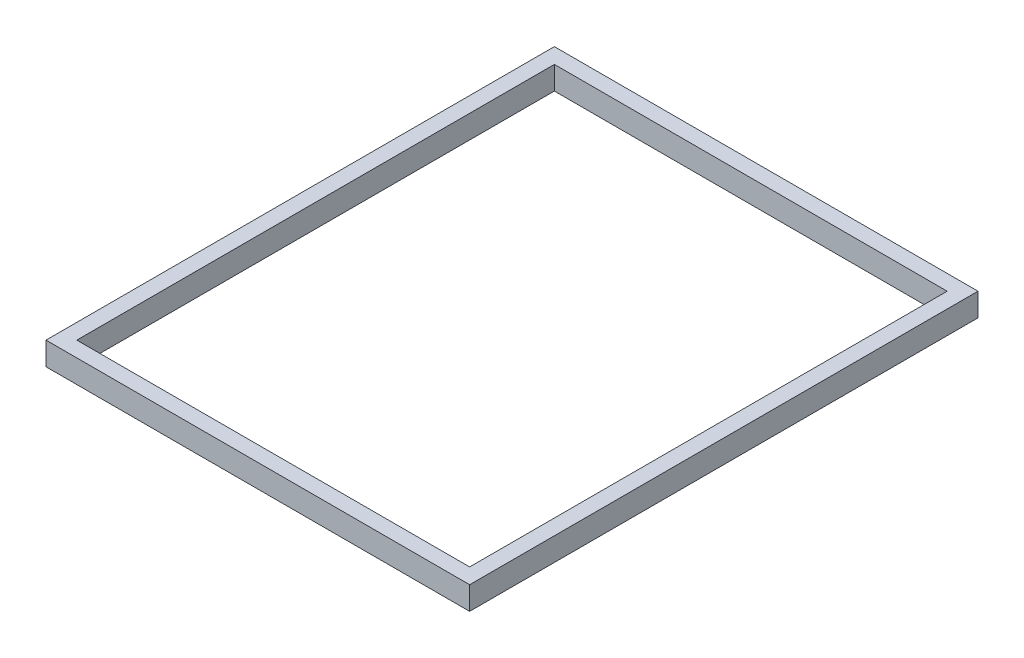
ISO-10303-21;
HEADER;
FILE_DESCRIPTION(('STEP AP214'),'2;1');
FILE_NAME('part.step','',(''),(''),'','','');
FILE_SCHEMA(('AUTOMOTIVE_DESIGN { 1 0 10303 214 1 1 1 1 }'));
ENDSEC;
DATA;
#1=APPLICATION_CONTEXT('core data for automotive mechanical design processes');
#2=APPLICATION_PROTOCOL_DEFINITION('international standard','automotive_design',2000,#1);
#3=PRODUCT_CONTEXT('',#1,'mechanical');
#4=PRODUCT('Part','Part','',(#3));
#5=PRODUCT_RELATED_PRODUCT_CATEGORY('part','',(#4));
#6=PRODUCT_DEFINITION_FORMATION('','',#4);
#7=PRODUCT_DEFINITION_CONTEXT('part definition',#1,'design');
#8=PRODUCT_DEFINITION('design','',#6,#7);
#9=PRODUCT_DEFINITION_SHAPE('','',#8);
#10=(LENGTH_UNIT() NAMED_UNIT(*) SI_UNIT(.MILLI.,.METRE.));
#11=(NAMED_UNIT(*) PLANE_ANGLE_UNIT() SI_UNIT($,.RADIAN.));
#12=(NAMED_UNIT(*) SI_UNIT($,.STERADIAN.) SOLID_ANGLE_UNIT());
#13=UNCERTAINTY_MEASURE_WITH_UNIT(LENGTH_MEASURE(1.E-05),#10,'distance_accuracy_value','');
#14=(GEOMETRIC_REPRESENTATION_CONTEXT(3) GLOBAL_UNCERTAINTY_ASSIGNED_CONTEXT((#13)) GLOBAL_UNIT_ASSIGNED_CONTEXT((#10,
#11,#12)) REPRESENTATION_CONTEXT('',''));
#15=CARTESIAN_POINT('',(0.,0.,0.));
#16=DIRECTION('',(0.,0.,1.));
#17=DIRECTION('',(1.,0.,0.));
#18=AXIS2_PLACEMENT_3D('',#15,#16,#17);
#19=CARTESIAN_POINT('',(0.,3.81,0.));
#20=DIRECTION('',(0.,-1.,0.));
#21=DIRECTION('',(0.,0.,-1.));
#22=AXIS2_PLACEMENT_3D('',#19,#20,#21);
#23=PLANE('',#22);
#24=DIRECTION('',(0.,0.,1.));
#25=VECTOR('',#24,1.);
#26=CARTESIAN_POINT('',(-34.925,3.81,41.91));
#27=LINE('',#26,#25);
#28=CARTESIAN_POINT('',(-34.925,3.81,-41.91));
#29=VERTEX_POINT('',#28);
#30=CARTESIAN_POINT('',(-34.925,3.81,41.91));
#31=VERTEX_POINT('',#30);
#32=EDGE_CURVE('E153',#29,#31,#27,.T.);
#33=ORIENTED_EDGE('',*,*,#32,.T.);
#34=DIRECTION('',(1.,0.,0.));
#35=VECTOR('',#34,1.);
#36=CARTESIAN_POINT('',(-34.925,3.81,41.91));
#37=LINE('',#36,#35);
#38=CARTESIAN_POINT('',(34.925,3.81,41.91));
#39=VERTEX_POINT('',#38);
#40=EDGE_CURVE('E157',#31,#39,#37,.T.);
#41=ORIENTED_EDGE('',*,*,#40,.T.);
#42=DIRECTION('',(0.,0.,-1.));
#43=VECTOR('',#42,1.);
#44=CARTESIAN_POINT('',(34.925,3.81,41.91));
#45=LINE('',#44,#43);
#46=CARTESIAN_POINT('',(34.925,3.81,-41.91));
#47=VERTEX_POINT('',#46);
#48=EDGE_CURVE('E161',#39,#47,#45,.T.);
#49=ORIENTED_EDGE('',*,*,#48,.T.);
#50=DIRECTION('',(-1.,0.,0.));
#51=VECTOR('',#50,1.);
#52=CARTESIAN_POINT('',(-34.925,3.81,-41.91));
#53=LINE('',#52,#51);
#54=EDGE_CURVE('E164',#47,#29,#53,.T.);
#55=ORIENTED_EDGE('',*,*,#54,.T.);
#56=EDGE_LOOP('',(#33,#41,#49,#55));
#57=FACE_BOUND('',#56,.T.);
#58=DIRECTION('',(0.,0.,1.));
#59=VECTOR('',#58,1.);
#60=CARTESIAN_POINT('',(-32.385,3.81,39.37));
#61=LINE('',#60,#59);
#62=CARTESIAN_POINT('',(-32.385,3.81,-39.37));
#63=VERTEX_POINT('',#62);
#64=CARTESIAN_POINT('',(-32.385,3.81,39.37));
#65=VERTEX_POINT('',#64);
#66=EDGE_CURVE('E105',#63,#65,#61,.T.);
#67=ORIENTED_EDGE('',*,*,#66,.F.);
#68=DIRECTION('',(-1.,0.,0.));
#69=VECTOR('',#68,1.);
#70=CARTESIAN_POINT('',(-32.385,3.81,-39.37));
#71=LINE('',#70,#69);
#72=CARTESIAN_POINT('',(32.385,3.81,-39.37));
#73=VERTEX_POINT('',#72);
#74=EDGE_CURVE('E131',#73,#63,#71,.T.);
#75=ORIENTED_EDGE('',*,*,#74,.F.);
#76=DIRECTION('',(0.,0.,-1.));
#77=VECTOR('',#76,1.);
#78=CARTESIAN_POINT('',(32.385,3.81,39.37));
#79=LINE('',#78,#77);
#80=CARTESIAN_POINT('',(32.385,3.81,39.37));
#81=VERTEX_POINT('',#80);
#82=EDGE_CURVE('E127',#81,#73,#79,.T.);
#83=ORIENTED_EDGE('',*,*,#82,.F.);
#84=DIRECTION('',(1.,0.,0.));
#85=VECTOR('',#84,1.);
#86=CARTESIAN_POINT('',(-32.385,3.81,39.37));
#87=LINE('',#86,#85);
#88=EDGE_CURVE('E114',#65,#81,#87,.T.);
#89=ORIENTED_EDGE('',*,*,#88,.F.);
#90=EDGE_LOOP('',(#67,#75,#83,#89));
#91=FACE_BOUND('',#90,.T.);
#92=ADVANCED_FACE('F39',(#57,#91),#23,.F.);
#93=CARTESIAN_POINT('',(0.,0.,0.));
#94=DIRECTION('',(0.,-1.,0.));
#95=DIRECTION('',(0.,0.,-1.));
#96=AXIS2_PLACEMENT_3D('',#93,#94,#95);
#97=PLANE('',#96);
#98=DIRECTION('',(0.,0.,1.));
#99=VECTOR('',#98,1.);
#100=CARTESIAN_POINT('',(-34.925,0.,41.91));
#101=LINE('',#100,#99);
#102=CARTESIAN_POINT('',(-34.925,0.,-41.91));
#103=VERTEX_POINT('',#102);
#104=CARTESIAN_POINT('',(-34.925,0.,41.91));
#105=VERTEX_POINT('',#104);
#106=EDGE_CURVE('E123',#103,#105,#101,.T.);
#107=ORIENTED_EDGE('',*,*,#106,.F.);
#108=DIRECTION('',(-1.,0.,0.));
#109=VECTOR('',#108,1.);
#110=CARTESIAN_POINT('',(-34.925,0.,-41.91));
#111=LINE('',#110,#109);
#112=CARTESIAN_POINT('',(34.925,0.,-41.91));
#113=VERTEX_POINT('',#112);
#114=EDGE_CURVE('E158',#113,#103,#111,.T.);
#115=ORIENTED_EDGE('',*,*,#114,.F.);
#116=DIRECTION('',(0.,0.,-1.));
#117=VECTOR('',#116,1.);
#118=CARTESIAN_POINT('',(34.925,0.,41.91));
#119=LINE('',#118,#117);
#120=CARTESIAN_POINT('',(34.925,0.,41.91));
#121=VERTEX_POINT('',#120);
#122=EDGE_CURVE('E174',#121,#113,#119,.T.);
#123=ORIENTED_EDGE('',*,*,#122,.F.);
#124=DIRECTION('',(1.,0.,0.));
#125=VECTOR('',#124,1.);
#126=CARTESIAN_POINT('',(-34.925,0.,41.91));
#127=LINE('',#126,#125);
#128=EDGE_CURVE('E171',#105,#121,#127,.T.);
#129=ORIENTED_EDGE('',*,*,#128,.F.);
#130=EDGE_LOOP('',(#107,#115,#123,#129));
#131=FACE_BOUND('',#130,.T.);
#132=DIRECTION('',(-1.,0.,0.));
#133=VECTOR('',#132,1.);
#134=CARTESIAN_POINT('',(-32.385,0.,-39.37));
#135=LINE('',#134,#133);
#136=CARTESIAN_POINT('',(32.385,0.,-39.37));
#137=VERTEX_POINT('',#136);
#138=CARTESIAN_POINT('',(-32.385,0.,-39.37));
#139=VERTEX_POINT('',#138);
#140=EDGE_CURVE('E115',#137,#139,#135,.T.);
#141=ORIENTED_EDGE('',*,*,#140,.T.);
#142=DIRECTION('',(0.,0.,1.));
#143=VECTOR('',#142,1.);
#144=CARTESIAN_POINT('',(-32.385,0.,39.37));
#145=LINE('',#144,#143);
#146=CARTESIAN_POINT('',(-32.385,0.,39.37));
#147=VERTEX_POINT('',#146);
#148=EDGE_CURVE('E63',#139,#147,#145,.T.);
#149=ORIENTED_EDGE('',*,*,#148,.T.);
#150=DIRECTION('',(1.,0.,0.));
#151=VECTOR('',#150,1.);
#152=CARTESIAN_POINT('',(-32.385,0.,39.37));
#153=LINE('',#152,#151);
#154=CARTESIAN_POINT('',(32.385,0.,39.37));
#155=VERTEX_POINT('',#154);
#156=EDGE_CURVE('E121',#147,#155,#153,.T.);
#157=ORIENTED_EDGE('',*,*,#156,.T.);
#158=DIRECTION('',(0.,0.,-1.));
#159=VECTOR('',#158,1.);
#160=CARTESIAN_POINT('',(32.385,0.,39.37));
#161=LINE('',#160,#159);
#162=EDGE_CURVE('E140',#155,#137,#161,.T.);
#163=ORIENTED_EDGE('',*,*,#162,.T.);
#164=EDGE_LOOP('',(#141,#149,#157,#163));
#165=FACE_BOUND('',#164,.T.);
#166=ADVANCED_FACE('F197',(#131,#165),#97,.T.);
#167=CARTESIAN_POINT('',(-34.925,3.81,41.91));
#168=DIRECTION('',(1.,0.,0.));
#169=DIRECTION('',(0.,0.,-1.));
#170=AXIS2_PLACEMENT_3D('',#167,#168,#169);
#171=PLANE('',#170);
#172=ORIENTED_EDGE('',*,*,#106,.T.);
#173=DIRECTION('',(0.,-1.,0.));
#174=VECTOR('',#173,1.);
#175=CARTESIAN_POINT('',(-34.925,3.81,41.91));
#176=LINE('',#175,#174);
#177=EDGE_CURVE('E11',#31,#105,#176,.T.);
#178=ORIENTED_EDGE('',*,*,#177,.F.);
#179=ORIENTED_EDGE('',*,*,#32,.F.);
#180=DIRECTION('',(0.,-1.,0.));
#181=VECTOR('',#180,1.);
#182=CARTESIAN_POINT('',(-34.925,3.81,-41.91));
#183=LINE('',#182,#181);
#184=EDGE_CURVE('E167',#29,#103,#183,.T.);
#185=ORIENTED_EDGE('',*,*,#184,.T.);
#186=EDGE_LOOP('',(#172,#178,#179,#185));
#187=FACE_BOUND('',#186,.T.);
#188=ADVANCED_FACE('F41',(#187),#171,.F.);
#189=CARTESIAN_POINT('',(-34.925,3.81,41.91));
#190=DIRECTION('',(0.,0.,-1.));
#191=DIRECTION('',(-1.,0.,0.));
#192=AXIS2_PLACEMENT_3D('',#189,#190,#191);
#193=PLANE('',#192);
#194=ORIENTED_EDGE('',*,*,#128,.T.);
#195=DIRECTION('',(0.,-1.,0.));
#196=VECTOR('',#195,1.);
#197=CARTESIAN_POINT('',(34.925,3.81,41.91));
#198=LINE('',#197,#196);
#199=EDGE_CURVE('E48',#39,#121,#198,.T.);
#200=ORIENTED_EDGE('',*,*,#199,.F.);
#201=ORIENTED_EDGE('',*,*,#40,.F.);
#202=ORIENTED_EDGE('',*,*,#177,.T.);
#203=EDGE_LOOP('',(#194,#200,#201,#202));
#204=FACE_BOUND('',#203,.T.);
#205=ADVANCED_FACE('F207',(#204),#193,.F.);
#206=CARTESIAN_POINT('',(34.925,3.81,41.91));
#207=DIRECTION('',(-1.,0.,0.));
#208=DIRECTION('',(0.,0.,1.));
#209=AXIS2_PLACEMENT_3D('',#206,#207,#208);
#210=PLANE('',#209);
#211=ORIENTED_EDGE('',*,*,#122,.T.);
#212=DIRECTION('',(0.,-1.,0.));
#213=VECTOR('',#212,1.);
#214=CARTESIAN_POINT('',(34.925,3.81,-41.91));
#215=LINE('',#214,#213);
#216=EDGE_CURVE('E182',#47,#113,#215,.T.);
#217=ORIENTED_EDGE('',*,*,#216,.F.);
#218=ORIENTED_EDGE('',*,*,#48,.F.);
#219=ORIENTED_EDGE('',*,*,#199,.T.);
#220=EDGE_LOOP('',(#211,#217,#218,#219));
#221=FACE_BOUND('',#220,.T.);
#222=ADVANCED_FACE('F191',(#221),#210,.F.);
#223=CARTESIAN_POINT('',(-34.925,3.81,-41.91));
#224=DIRECTION('',(0.,0.,1.));
#225=DIRECTION('',(1.,0.,0.));
#226=AXIS2_PLACEMENT_3D('',#223,#224,#225);
#227=PLANE('',#226);
#228=ORIENTED_EDGE('',*,*,#114,.T.);
#229=ORIENTED_EDGE('',*,*,#184,.F.);
#230=ORIENTED_EDGE('',*,*,#54,.F.);
#231=ORIENTED_EDGE('',*,*,#216,.T.);
#232=EDGE_LOOP('',(#228,#229,#230,#231));
#233=FACE_BOUND('',#232,.T.);
#234=ADVANCED_FACE('F201',(#233),#227,.F.);
#235=CARTESIAN_POINT('',(-32.385,3.81,39.37));
#236=DIRECTION('',(1.,0.,0.));
#237=DIRECTION('',(0.,0.,-1.));
#238=AXIS2_PLACEMENT_3D('',#235,#236,#237);
#239=PLANE('',#238);
#240=ORIENTED_EDGE('',*,*,#148,.F.);
#241=DIRECTION('',(0.,-1.,0.));
#242=VECTOR('',#241,1.);
#243=CARTESIAN_POINT('',(-32.385,3.81,-39.37));
#244=LINE('',#243,#242);
#245=EDGE_CURVE('E109',#63,#139,#244,.T.);
#246=ORIENTED_EDGE('',*,*,#245,.F.);
#247=ORIENTED_EDGE('',*,*,#66,.T.);
#248=DIRECTION('',(0.,-1.,0.));
#249=VECTOR('',#248,1.);
#250=CARTESIAN_POINT('',(-32.385,3.81,39.37));
#251=LINE('',#250,#249);
#252=EDGE_CURVE('E108',#65,#147,#251,.T.);
#253=ORIENTED_EDGE('',*,*,#252,.T.);
#254=EDGE_LOOP('',(#240,#246,#247,#253));
#255=FACE_BOUND('',#254,.T.);
#256=ADVANCED_FACE('F107',(#255),#239,.T.);
#257=CARTESIAN_POINT('',(-32.385,3.81,39.37));
#258=DIRECTION('',(0.,0.,-1.));
#259=DIRECTION('',(-1.,0.,0.));
#260=AXIS2_PLACEMENT_3D('',#257,#258,#259);
#261=PLANE('',#260);
#262=ORIENTED_EDGE('',*,*,#156,.F.);
#263=ORIENTED_EDGE('',*,*,#252,.F.);
#264=ORIENTED_EDGE('',*,*,#88,.T.);
#265=DIRECTION('',(0.,-1.,0.));
#266=VECTOR('',#265,1.);
#267=CARTESIAN_POINT('',(32.385,3.81,39.37));
#268=LINE('',#267,#266);
#269=EDGE_CURVE('E124',#81,#155,#268,.T.);
#270=ORIENTED_EDGE('',*,*,#269,.T.);
#271=EDGE_LOOP('',(#262,#263,#264,#270));
#272=FACE_BOUND('',#271,.T.);
#273=ADVANCED_FACE('F118',(#272),#261,.T.);
#274=CARTESIAN_POINT('',(32.385,3.81,39.37));
#275=DIRECTION('',(-1.,0.,0.));
#276=DIRECTION('',(0.,0.,1.));
#277=AXIS2_PLACEMENT_3D('',#274,#275,#276);
#278=PLANE('',#277);
#279=ORIENTED_EDGE('',*,*,#162,.F.);
#280=ORIENTED_EDGE('',*,*,#269,.F.);
#281=ORIENTED_EDGE('',*,*,#82,.T.);
#282=DIRECTION('',(0.,-1.,0.));
#283=VECTOR('',#282,1.);
#284=CARTESIAN_POINT('',(32.385,3.81,-39.37));
#285=LINE('',#284,#283);
#286=EDGE_CURVE('E55',#73,#137,#285,.T.);
#287=ORIENTED_EDGE('',*,*,#286,.T.);
#288=EDGE_LOOP('',(#279,#280,#281,#287));
#289=FACE_BOUND('',#288,.T.);
#290=ADVANCED_FACE('F230',(#289),#278,.T.);
#291=CARTESIAN_POINT('',(-32.385,3.81,-39.37));
#292=DIRECTION('',(0.,0.,1.));
#293=DIRECTION('',(1.,0.,0.));
#294=AXIS2_PLACEMENT_3D('',#291,#292,#293);
#295=PLANE('',#294);
#296=ORIENTED_EDGE('',*,*,#140,.F.);
#297=ORIENTED_EDGE('',*,*,#286,.F.);
#298=ORIENTED_EDGE('',*,*,#74,.T.);
#299=ORIENTED_EDGE('',*,*,#245,.T.);
#300=EDGE_LOOP('',(#296,#297,#298,#299));
#301=FACE_BOUND('',#300,.T.);
#302=ADVANCED_FACE('F234',(#301),#295,.T.);
#303=CLOSED_SHELL('',(#92,#166,#188,#205,#222,#234,#256,#273,#290,#302));
#304=MANIFOLD_SOLID_BREP('B2',#303);
#305=ADVANCED_BREP_SHAPE_REPRESENTATION('',(#18,#304),#14);
#306=SHAPE_DEFINITION_REPRESENTATION(#9,#305);
ENDSEC;
END-ISO-10303-21;
